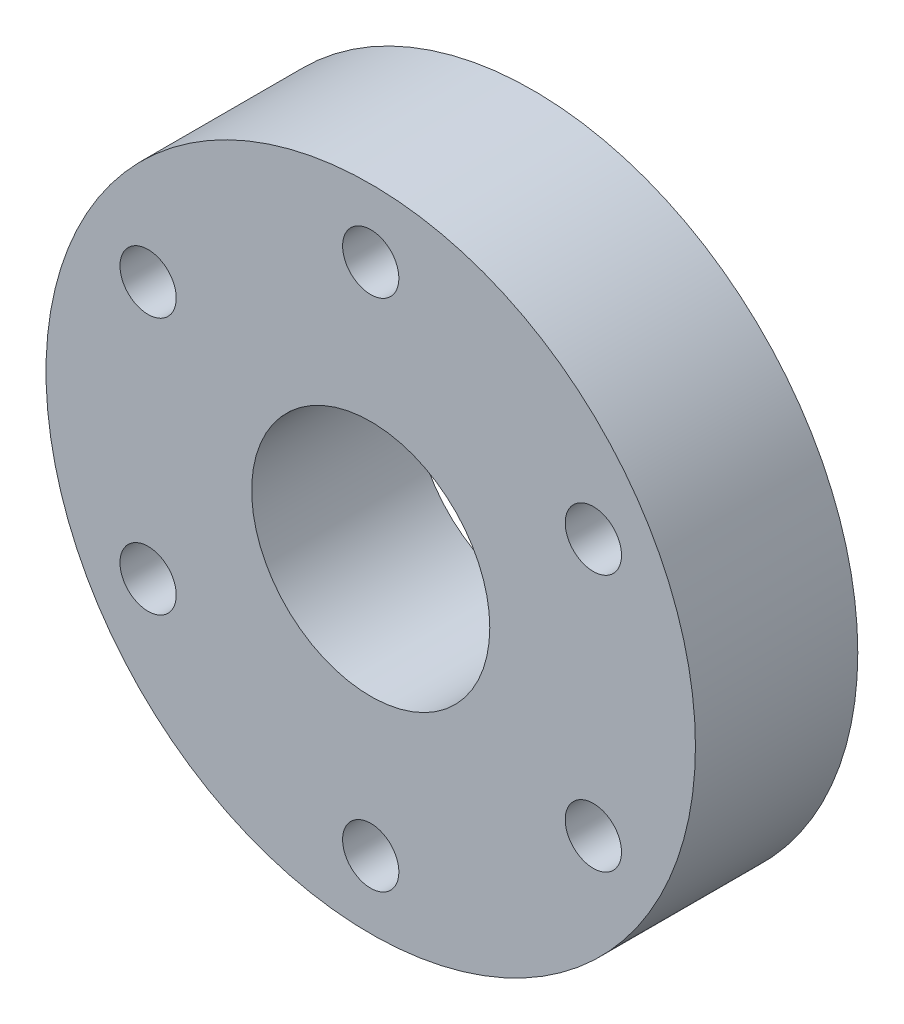
ISO-10303-21;
HEADER;
FILE_DESCRIPTION(('STEP AP214'),'2;1');
FILE_NAME('part.step','',(''),(''),'','','');
FILE_SCHEMA(('AUTOMOTIVE_DESIGN { 1 0 10303 214 1 1 1 1 }'));
ENDSEC;
DATA;
#1=APPLICATION_CONTEXT('core data for automotive mechanical design processes');
#2=APPLICATION_PROTOCOL_DEFINITION('international standard','automotive_design',2000,#1);
#3=PRODUCT_CONTEXT('',#1,'mechanical');
#4=PRODUCT('Part','Part','',(#3));
#5=PRODUCT_RELATED_PRODUCT_CATEGORY('part','',(#4));
#6=PRODUCT_DEFINITION_FORMATION('','',#4);
#7=PRODUCT_DEFINITION_CONTEXT('part definition',#1,'design');
#8=PRODUCT_DEFINITION('design','',#6,#7);
#9=PRODUCT_DEFINITION_SHAPE('','',#8);
#10=(LENGTH_UNIT() NAMED_UNIT(*) SI_UNIT(.MILLI.,.METRE.));
#11=(NAMED_UNIT(*) PLANE_ANGLE_UNIT() SI_UNIT($,.RADIAN.));
#12=(NAMED_UNIT(*) SI_UNIT($,.STERADIAN.) SOLID_ANGLE_UNIT());
#13=UNCERTAINTY_MEASURE_WITH_UNIT(LENGTH_MEASURE(1.E-05),#10,'distance_accuracy_value','');
#14=(GEOMETRIC_REPRESENTATION_CONTEXT(3) GLOBAL_UNCERTAINTY_ASSIGNED_CONTEXT((#13)) GLOBAL_UNIT_ASSIGNED_CONTEXT((#10,
#11,#12)) REPRESENTATION_CONTEXT('',''));
#15=CARTESIAN_POINT('',(0.,0.,0.));
#16=DIRECTION('',(0.,0.,1.));
#17=DIRECTION('',(1.,0.,0.));
#18=AXIS2_PLACEMENT_3D('',#15,#16,#17);
#19=CARTESIAN_POINT('',(0.,0.,15.));
#20=DIRECTION('',(0.,0.,1.));
#21=DIRECTION('',(1.,0.,0.));
#22=AXIS2_PLACEMENT_3D('',#19,#20,#21);
#23=PLANE('',#22);
#24=CARTESIAN_POINT('',(-20.5681033398784,-11.8750000000012,15.));
#25=DIRECTION('',(0.,0.,1.));
#26=DIRECTION('',(1.,0.,0.));
#27=AXIS2_PLACEMENT_3D('',#24,#25,#26);
#28=CIRCLE('',#27,2.60000000000249);
#29=CARTESIAN_POINT('',(-17.9681033398759,-11.8750000000012,15.));
#30=VERTEX_POINT('',#29);
#31=EDGE_CURVE('E74',#30,#30,#28,.T.);
#32=ORIENTED_EDGE('',*,*,#31,.F.);
#33=EDGE_LOOP('',(#32));
#34=FACE_BOUND('',#33,.T.);
#35=CARTESIAN_POINT('',(20.5681033398824,-11.8749999999988,15.));
#36=DIRECTION('',(0.,0.,1.));
#37=DIRECTION('',(1.,0.,0.));
#38=AXIS2_PLACEMENT_3D('',#35,#36,#37);
#39=CIRCLE('',#38,2.6000000000017);
#40=CARTESIAN_POINT('',(23.1681033398841,-11.8749999999988,15.));
#41=VERTEX_POINT('',#40);
#42=EDGE_CURVE('E62',#41,#41,#39,.T.);
#43=ORIENTED_EDGE('',*,*,#42,.F.);
#44=EDGE_LOOP('',(#43));
#45=FACE_BOUND('',#44,.T.);
#46=CARTESIAN_POINT('',(0.,0.,15.));
#47=DIRECTION('',(0.,0.,1.));
#48=DIRECTION('',(1.,0.,0.));
#49=AXIS2_PLACEMENT_3D('',#46,#47,#48);
#50=CIRCLE('',#49,11.);
#51=CARTESIAN_POINT('',(11.,0.,15.));
#52=VERTEX_POINT('',#51);
#53=EDGE_CURVE('E50',#52,#52,#50,.T.);
#54=ORIENTED_EDGE('',*,*,#53,.F.);
#55=EDGE_LOOP('',(#54));
#56=FACE_BOUND('',#55,.T.);
#57=CARTESIAN_POINT('',(0.,0.,15.));
#58=DIRECTION('',(0.,0.,1.));
#59=DIRECTION('',(1.,0.,0.));
#60=AXIS2_PLACEMENT_3D('',#57,#58,#59);
#61=CIRCLE('',#60,30.);
#62=CARTESIAN_POINT('',(30.,0.,15.));
#63=VERTEX_POINT('',#62);
#64=EDGE_CURVE('E10',#63,#63,#61,.T.);
#65=ORIENTED_EDGE('',*,*,#64,.T.);
#66=EDGE_LOOP('',(#65));
#67=FACE_BOUND('',#66,.T.);
#68=CARTESIAN_POINT('',(0.,23.75,15.));
#69=DIRECTION('',(0.,0.,1.));
#70=DIRECTION('',(1.,0.,0.));
#71=AXIS2_PLACEMENT_3D('',#68,#69,#70);
#72=CIRCLE('',#71,2.6);
#73=CARTESIAN_POINT('',(2.6,23.75,15.));
#74=VERTEX_POINT('',#73);
#75=EDGE_CURVE('E45',#74,#74,#72,.T.);
#76=ORIENTED_EDGE('',*,*,#75,.F.);
#77=EDGE_LOOP('',(#76));
#78=FACE_BOUND('',#77,.T.);
#79=CARTESIAN_POINT('',(20.5681033398811,11.8750000000012,15.));
#80=DIRECTION('',(0.,0.,1.));
#81=DIRECTION('',(1.,0.,0.));
#82=AXIS2_PLACEMENT_3D('',#79,#80,#81);
#83=CIRCLE('',#82,2.60000000000036);
#84=CARTESIAN_POINT('',(23.1681033398814,11.8750000000012,15.));
#85=VERTEX_POINT('',#84);
#86=EDGE_CURVE('E56',#85,#85,#83,.T.);
#87=ORIENTED_EDGE('',*,*,#86,.F.);
#88=EDGE_LOOP('',(#87));
#89=FACE_BOUND('',#88,.T.);
#90=CARTESIAN_POINT('',(2.69133678744446E-12,-23.75,15.));
#91=DIRECTION('',(0.,0.,1.));
#92=DIRECTION('',(1.,0.,0.));
#93=AXIS2_PLACEMENT_3D('',#90,#91,#92);
#94=CIRCLE('',#93,2.60000000000273);
#95=CARTESIAN_POINT('',(2.60000000000542,-23.75,15.));
#96=VERTEX_POINT('',#95);
#97=EDGE_CURVE('E68',#96,#96,#94,.T.);
#98=ORIENTED_EDGE('',*,*,#97,.F.);
#99=EDGE_LOOP('',(#98));
#100=FACE_BOUND('',#99,.T.);
#101=CARTESIAN_POINT('',(-20.5681033398798,11.8749999999988,15.));
#102=DIRECTION('',(0.,0.,1.));
#103=DIRECTION('',(1.,0.,0.));
#104=AXIS2_PLACEMENT_3D('',#101,#102,#103);
#105=CIRCLE('',#104,2.60000000000127);
#106=CARTESIAN_POINT('',(-17.9681033398785,11.8749999999988,15.));
#107=VERTEX_POINT('',#106);
#108=EDGE_CURVE('E80',#107,#107,#105,.T.);
#109=ORIENTED_EDGE('',*,*,#108,.F.);
#110=EDGE_LOOP('',(#109));
#111=FACE_BOUND('',#110,.T.);
#112=ADVANCED_FACE('F34',(#34,#45,#56,#67,#78,#89,#100,#111),#23,.T.);
#113=CARTESIAN_POINT('',(0.,0.,0.));
#114=DIRECTION('',(0.,0.,1.));
#115=DIRECTION('',(1.,0.,0.));
#116=AXIS2_PLACEMENT_3D('',#113,#114,#115);
#117=PLANE('',#116);
#118=CARTESIAN_POINT('',(0.,0.,0.));
#119=DIRECTION('',(0.,0.,1.));
#120=DIRECTION('',(1.,0.,0.));
#121=AXIS2_PLACEMENT_3D('',#118,#119,#120);
#122=CIRCLE('',#121,30.);
#123=CARTESIAN_POINT('',(30.,0.,0.));
#124=VERTEX_POINT('',#123);
#125=EDGE_CURVE('E38',#124,#124,#122,.T.);
#126=ORIENTED_EDGE('',*,*,#125,.F.);
#127=EDGE_LOOP('',(#126));
#128=FACE_BOUND('',#127,.T.);
#129=CARTESIAN_POINT('',(0.,23.75,0.));
#130=DIRECTION('',(0.,0.,1.));
#131=DIRECTION('',(1.,0.,0.));
#132=AXIS2_PLACEMENT_3D('',#129,#130,#131);
#133=CIRCLE('',#132,2.6);
#134=CARTESIAN_POINT('',(2.6,23.75,0.));
#135=VERTEX_POINT('',#134);
#136=EDGE_CURVE('E47',#135,#135,#133,.T.);
#137=ORIENTED_EDGE('',*,*,#136,.T.);
#138=EDGE_LOOP('',(#137));
#139=FACE_BOUND('',#138,.T.);
#140=CARTESIAN_POINT('',(0.,0.,0.));
#141=DIRECTION('',(0.,0.,1.));
#142=DIRECTION('',(1.,0.,0.));
#143=AXIS2_PLACEMENT_3D('',#140,#141,#142);
#144=CIRCLE('',#143,11.);
#145=CARTESIAN_POINT('',(11.,0.,0.));
#146=VERTEX_POINT('',#145);
#147=EDGE_CURVE('E53',#146,#146,#144,.T.);
#148=ORIENTED_EDGE('',*,*,#147,.T.);
#149=EDGE_LOOP('',(#148));
#150=FACE_BOUND('',#149,.T.);
#151=CARTESIAN_POINT('',(20.5681033398811,11.8750000000012,0.));
#152=DIRECTION('',(0.,0.,1.));
#153=DIRECTION('',(1.,0.,0.));
#154=AXIS2_PLACEMENT_3D('',#151,#152,#153);
#155=CIRCLE('',#154,2.60000000000036);
#156=CARTESIAN_POINT('',(23.1681033398814,11.8750000000012,0.));
#157=VERTEX_POINT('',#156);
#158=EDGE_CURVE('E59',#157,#157,#155,.T.);
#159=ORIENTED_EDGE('',*,*,#158,.T.);
#160=EDGE_LOOP('',(#159));
#161=FACE_BOUND('',#160,.T.);
#162=CARTESIAN_POINT('',(20.5681033398824,-11.8749999999988,0.));
#163=DIRECTION('',(0.,0.,1.));
#164=DIRECTION('',(1.,0.,0.));
#165=AXIS2_PLACEMENT_3D('',#162,#163,#164);
#166=CIRCLE('',#165,2.6000000000017);
#167=CARTESIAN_POINT('',(23.1681033398841,-11.8749999999988,0.));
#168=VERTEX_POINT('',#167);
#169=EDGE_CURVE('E65',#168,#168,#166,.T.);
#170=ORIENTED_EDGE('',*,*,#169,.T.);
#171=EDGE_LOOP('',(#170));
#172=FACE_BOUND('',#171,.T.);
#173=CARTESIAN_POINT('',(2.69133678744446E-12,-23.75,0.));
#174=DIRECTION('',(0.,0.,1.));
#175=DIRECTION('',(1.,0.,0.));
#176=AXIS2_PLACEMENT_3D('',#173,#174,#175);
#177=CIRCLE('',#176,2.60000000000273);
#178=CARTESIAN_POINT('',(2.60000000000542,-23.75,0.));
#179=VERTEX_POINT('',#178);
#180=EDGE_CURVE('E71',#179,#179,#177,.T.);
#181=ORIENTED_EDGE('',*,*,#180,.T.);
#182=EDGE_LOOP('',(#181));
#183=FACE_BOUND('',#182,.T.);
#184=CARTESIAN_POINT('',(-20.5681033398784,-11.8750000000012,0.));
#185=DIRECTION('',(0.,0.,1.));
#186=DIRECTION('',(1.,0.,0.));
#187=AXIS2_PLACEMENT_3D('',#184,#185,#186);
#188=CIRCLE('',#187,2.60000000000249);
#189=CARTESIAN_POINT('',(-17.9681033398759,-11.8750000000012,0.));
#190=VERTEX_POINT('',#189);
#191=EDGE_CURVE('E77',#190,#190,#188,.T.);
#192=ORIENTED_EDGE('',*,*,#191,.T.);
#193=EDGE_LOOP('',(#192));
#194=FACE_BOUND('',#193,.T.);
#195=CARTESIAN_POINT('',(-20.5681033398798,11.8749999999988,0.));
#196=DIRECTION('',(0.,0.,1.));
#197=DIRECTION('',(1.,0.,0.));
#198=AXIS2_PLACEMENT_3D('',#195,#196,#197);
#199=CIRCLE('',#198,2.60000000000127);
#200=CARTESIAN_POINT('',(-17.9681033398785,11.8749999999988,0.));
#201=VERTEX_POINT('',#200);
#202=EDGE_CURVE('E83',#201,#201,#199,.T.);
#203=ORIENTED_EDGE('',*,*,#202,.T.);
#204=EDGE_LOOP('',(#203));
#205=FACE_BOUND('',#204,.T.);
#206=ADVANCED_FACE('F93',(#128,#139,#150,#161,#172,#183,#194,#205),#117,.F.);
#207=CARTESIAN_POINT('',(0.,0.,15.));
#208=DIRECTION('',(0.,0.,-1.));
#209=DIRECTION('',(-1.,0.,0.));
#210=AXIS2_PLACEMENT_3D('',#207,#208,#209);
#211=CYLINDRICAL_SURFACE('',#210,30.);
#212=ORIENTED_EDGE('',*,*,#64,.F.);
#213=EDGE_LOOP('',(#212));
#214=FACE_BOUND('',#213,.T.);
#215=ORIENTED_EDGE('',*,*,#125,.T.);
#216=EDGE_LOOP('',(#215));
#217=FACE_BOUND('',#216,.T.);
#218=ADVANCED_FACE('F36',(#214,#217),#211,.T.);
#219=CARTESIAN_POINT('',(0.,23.75,15.));
#220=DIRECTION('',(0.,0.,-1.));
#221=DIRECTION('',(-1.,0.,0.));
#222=AXIS2_PLACEMENT_3D('',#219,#220,#221);
#223=CYLINDRICAL_SURFACE('',#222,2.6);
#224=ORIENTED_EDGE('',*,*,#75,.T.);
#225=EDGE_LOOP('',(#224));
#226=FACE_BOUND('',#225,.T.);
#227=ORIENTED_EDGE('',*,*,#136,.F.);
#228=EDGE_LOOP('',(#227));
#229=FACE_BOUND('',#228,.T.);
#230=ADVANCED_FACE('F103',(#226,#229),#223,.F.);
#231=CARTESIAN_POINT('',(0.,0.,15.));
#232=DIRECTION('',(0.,0.,-1.));
#233=DIRECTION('',(-1.,0.,0.));
#234=AXIS2_PLACEMENT_3D('',#231,#232,#233);
#235=CYLINDRICAL_SURFACE('',#234,11.);
#236=ORIENTED_EDGE('',*,*,#53,.T.);
#237=EDGE_LOOP('',(#236));
#238=FACE_BOUND('',#237,.T.);
#239=ORIENTED_EDGE('',*,*,#147,.F.);
#240=EDGE_LOOP('',(#239));
#241=FACE_BOUND('',#240,.T.);
#242=ADVANCED_FACE('F106',(#238,#241),#235,.F.);
#243=CARTESIAN_POINT('',(20.5681033398811,11.8750000000012,15.));
#244=DIRECTION('',(0.,0.,-1.));
#245=DIRECTION('',(-1.,0.,0.));
#246=AXIS2_PLACEMENT_3D('',#243,#244,#245);
#247=CYLINDRICAL_SURFACE('',#246,2.60000000000036);
#248=ORIENTED_EDGE('',*,*,#86,.T.);
#249=EDGE_LOOP('',(#248));
#250=FACE_BOUND('',#249,.T.);
#251=ORIENTED_EDGE('',*,*,#158,.F.);
#252=EDGE_LOOP('',(#251));
#253=FACE_BOUND('',#252,.T.);
#254=ADVANCED_FACE('F110',(#250,#253),#247,.F.);
#255=CARTESIAN_POINT('',(20.5681033398824,-11.8749999999988,15.));
#256=DIRECTION('',(0.,0.,-1.));
#257=DIRECTION('',(-1.,0.,0.));
#258=AXIS2_PLACEMENT_3D('',#255,#256,#257);
#259=CYLINDRICAL_SURFACE('',#258,2.6000000000017);
#260=ORIENTED_EDGE('',*,*,#42,.T.);
#261=EDGE_LOOP('',(#260));
#262=FACE_BOUND('',#261,.T.);
#263=ORIENTED_EDGE('',*,*,#169,.F.);
#264=EDGE_LOOP('',(#263));
#265=FACE_BOUND('',#264,.T.);
#266=ADVANCED_FACE('F114',(#262,#265),#259,.F.);
#267=CARTESIAN_POINT('',(2.69133678744446E-12,-23.75,15.));
#268=DIRECTION('',(0.,0.,-1.));
#269=DIRECTION('',(-1.,0.,0.));
#270=AXIS2_PLACEMENT_3D('',#267,#268,#269);
#271=CYLINDRICAL_SURFACE('',#270,2.60000000000273);
#272=ORIENTED_EDGE('',*,*,#97,.T.);
#273=EDGE_LOOP('',(#272));
#274=FACE_BOUND('',#273,.T.);
#275=ORIENTED_EDGE('',*,*,#180,.F.);
#276=EDGE_LOOP('',(#275));
#277=FACE_BOUND('',#276,.T.);
#278=ADVANCED_FACE('F118',(#274,#277),#271,.F.);
#279=CARTESIAN_POINT('',(-20.5681033398784,-11.8750000000012,15.));
#280=DIRECTION('',(0.,0.,-1.));
#281=DIRECTION('',(-1.,0.,0.));
#282=AXIS2_PLACEMENT_3D('',#279,#280,#281);
#283=CYLINDRICAL_SURFACE('',#282,2.60000000000249);
#284=ORIENTED_EDGE('',*,*,#31,.T.);
#285=EDGE_LOOP('',(#284));
#286=FACE_BOUND('',#285,.T.);
#287=ORIENTED_EDGE('',*,*,#191,.F.);
#288=EDGE_LOOP('',(#287));
#289=FACE_BOUND('',#288,.T.);
#290=ADVANCED_FACE('F122',(#286,#289),#283,.F.);
#291=CARTESIAN_POINT('',(-20.5681033398798,11.8749999999988,15.));
#292=DIRECTION('',(0.,0.,-1.));
#293=DIRECTION('',(-1.,0.,0.));
#294=AXIS2_PLACEMENT_3D('',#291,#292,#293);
#295=CYLINDRICAL_SURFACE('',#294,2.60000000000127);
#296=ORIENTED_EDGE('',*,*,#108,.T.);
#297=EDGE_LOOP('',(#296));
#298=FACE_BOUND('',#297,.T.);
#299=ORIENTED_EDGE('',*,*,#202,.F.);
#300=EDGE_LOOP('',(#299));
#301=FACE_BOUND('',#300,.T.);
#302=ADVANCED_FACE('F89',(#298,#301),#295,.F.);
#303=CLOSED_SHELL('',(#112,#206,#218,#230,#242,#254,#266,#278,#290,#302));
#304=MANIFOLD_SOLID_BREP('B2',#303);
#305=ADVANCED_BREP_SHAPE_REPRESENTATION('',(#18,#304),#14);
#306=SHAPE_DEFINITION_REPRESENTATION(#9,#305);
ENDSEC;
END-ISO-10303-21;
